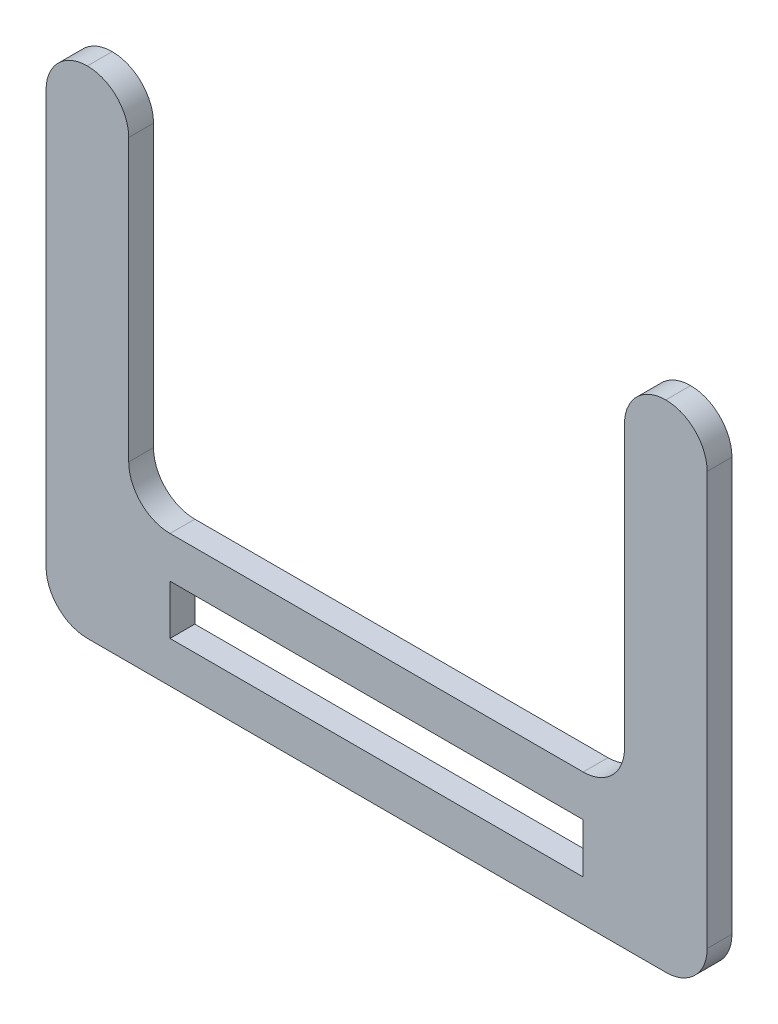
ISO-10303-21;
HEADER;
FILE_DESCRIPTION(('STEP AP214'),'2;1');
FILE_NAME('part.step','',(''),(''),'','','');
FILE_SCHEMA(('AUTOMOTIVE_DESIGN { 1 0 10303 214 1 1 1 1 }'));
ENDSEC;
DATA;
#1=APPLICATION_CONTEXT('core data for automotive mechanical design processes');
#2=APPLICATION_PROTOCOL_DEFINITION('international standard','automotive_design',2000,#1);
#3=PRODUCT_CONTEXT('',#1,'mechanical');
#4=PRODUCT('Part','Part','',(#3));
#5=PRODUCT_RELATED_PRODUCT_CATEGORY('part','',(#4));
#6=PRODUCT_DEFINITION_FORMATION('','',#4);
#7=PRODUCT_DEFINITION_CONTEXT('part definition',#1,'design');
#8=PRODUCT_DEFINITION('design','',#6,#7);
#9=PRODUCT_DEFINITION_SHAPE('','',#8);
#10=(LENGTH_UNIT() NAMED_UNIT(*) SI_UNIT(.MILLI.,.METRE.));
#11=(NAMED_UNIT(*) PLANE_ANGLE_UNIT() SI_UNIT($,.RADIAN.));
#12=(NAMED_UNIT(*) SI_UNIT($,.STERADIAN.) SOLID_ANGLE_UNIT());
#13=UNCERTAINTY_MEASURE_WITH_UNIT(LENGTH_MEASURE(1.E-05),#10,'distance_accuracy_value','');
#14=(GEOMETRIC_REPRESENTATION_CONTEXT(3) GLOBAL_UNCERTAINTY_ASSIGNED_CONTEXT((#13)) GLOBAL_UNIT_ASSIGNED_CONTEXT((#10,
#11,#12)) REPRESENTATION_CONTEXT('',''));
#15=CARTESIAN_POINT('',(0.,0.,0.));
#16=DIRECTION('',(0.,0.,1.));
#17=DIRECTION('',(1.,0.,0.));
#18=AXIS2_PLACEMENT_3D('',#15,#16,#17);
#19=CARTESIAN_POINT('',(-63.8455105633809,-4.50457746478873,2.99999999999977));
#20=DIRECTION('',(1.00000000000001,0.,0.));
#21=DIRECTION('',(0.,1.,0.));
#22=AXIS2_PLACEMENT_3D('',#19,#20,#21);
#23=PLANE('',#22);
#24=DIRECTION('',(0.,-1.,0.));
#25=VECTOR('',#24,1.);
#26=CARTESIAN_POINT('',(-63.8455105633809,-4.50457746478873,2.99999999999977));
#27=LINE('',#26,#25);
#28=CARTESIAN_POINT('',(-63.8455105633811,50.4954225352113,2.99999999999967));
#29=VERTEX_POINT('',#28);
#30=CARTESIAN_POINT('',(-63.8455105633809,0.495422535211267,2.99999999999981));
#31=VERTEX_POINT('',#30);
#32=EDGE_CURVE('E210',#29,#31,#27,.T.);
#33=ORIENTED_EDGE('',*,*,#32,.F.);
#34=DIRECTION('',(0.,0.,-1.00000000000001));
#35=VECTOR('',#34,1.);
#36=CARTESIAN_POINT('',(-63.8455105633811,50.4954225352113,2.99999999999967));
#37=LINE('',#36,#35);
#38=CARTESIAN_POINT('',(-63.8455105633811,50.4954225352113,-2.08166817117217E-13));
#39=VERTEX_POINT('',#38);
#40=EDGE_CURVE('E278',#29,#39,#37,.T.);
#41=ORIENTED_EDGE('',*,*,#40,.T.);
#42=DIRECTION('',(0.,-1.,0.));
#43=VECTOR('',#42,1.);
#44=CARTESIAN_POINT('',(-63.8455105633811,-4.50457746478872,-2.35922392732846E-13));
#45=LINE('',#44,#43);
#46=CARTESIAN_POINT('',(-63.8455105633811,0.495422535211357,0.));
#47=VERTEX_POINT('',#46);
#48=EDGE_CURVE('E190',#39,#47,#45,.T.);
#49=ORIENTED_EDGE('',*,*,#48,.T.);
#50=DIRECTION('',(0.,0.,-1.00000000000001));
#51=VECTOR('',#50,1.);
#52=CARTESIAN_POINT('',(-63.8455105633809,0.495422535211267,2.99999999999981));
#53=LINE('',#52,#51);
#54=EDGE_CURVE('E276',#47,#31,#53,.F.);
#55=ORIENTED_EDGE('',*,*,#54,.T.);
#56=EDGE_LOOP('',(#33,#41,#49,#55));
#57=FACE_BOUND('',#56,.T.);
#58=ADVANCED_FACE('F36',(#57),#23,.F.);
#59=CARTESIAN_POINT('',(-63.8455105633809,-4.50457746478873,2.99999999999977));
#60=DIRECTION('',(0.,1.,0.));
#61=DIRECTION('',(0.,0.,1.00000000000001));
#62=AXIS2_PLACEMENT_3D('',#59,#60,#61);
#63=PLANE('',#62);
#64=DIRECTION('',(1.00000000000001,0.,0.));
#65=VECTOR('',#64,1.);
#66=CARTESIAN_POINT('',(-63.8455105633811,-4.50457746478872,-2.35922392732846E-13));
#67=LINE('',#66,#65);
#68=CARTESIAN_POINT('',(-58.8455105633809,-4.50457746478868,-1.94289029309402E-13));
#69=VERTEX_POINT('',#68);
#70=CARTESIAN_POINT('',(11.1544894366199,-4.50457746478872,-1.66533453693773E-13));
#71=VERTEX_POINT('',#70);
#72=EDGE_CURVE('E195',#69,#71,#67,.T.);
#73=ORIENTED_EDGE('',*,*,#72,.T.);
#74=DIRECTION('',(0.,0.,-1.00000000000001));
#75=VECTOR('',#74,1.);
#76=CARTESIAN_POINT('',(11.1544894366198,-4.50457746478882,2.99999999999989));
#77=LINE('',#76,#75);
#78=CARTESIAN_POINT('',(11.1544894366198,-4.50457746478882,2.99999999999989));
#79=VERTEX_POINT('',#78);
#80=EDGE_CURVE('E283',#71,#79,#77,.F.);
#81=ORIENTED_EDGE('',*,*,#80,.T.);
#82=DIRECTION('',(1.00000000000001,0.,0.));
#83=VECTOR('',#82,1.);
#84=CARTESIAN_POINT('',(-63.8455105633809,-4.50457746478873,2.99999999999977));
#85=LINE('',#84,#83);
#86=CARTESIAN_POINT('',(-58.8455105633809,-4.50457746478873,2.9999999999997));
#87=VERTEX_POINT('',#86);
#88=EDGE_CURVE('E213',#87,#79,#85,.T.);
#89=ORIENTED_EDGE('',*,*,#88,.F.);
#90=DIRECTION('',(0.,0.,-1.00000000000001));
#91=VECTOR('',#90,1.);
#92=CARTESIAN_POINT('',(-58.8455105633809,-4.50457746478873,2.9999999999997));
#93=LINE('',#92,#91);
#94=EDGE_CURVE('E280',#87,#69,#93,.T.);
#95=ORIENTED_EDGE('',*,*,#94,.T.);
#96=EDGE_LOOP('',(#73,#81,#89,#95));
#97=FACE_BOUND('',#96,.T.);
#98=ADVANCED_FACE('F344',(#97),#63,.F.);
#99=CARTESIAN_POINT('',(16.1544894366199,55.4954225352114,2.99999999999993));
#100=DIRECTION('',(-1.00000000000001,0.,0.));
#101=DIRECTION('',(0.,-1.,0.));
#102=AXIS2_PLACEMENT_3D('',#99,#100,#101);
#103=PLANE('',#102);
#104=DIRECTION('',(0.,1.,0.));
#105=VECTOR('',#104,1.);
#106=CARTESIAN_POINT('',(16.1544894366199,55.4954225352113,0.));
#107=LINE('',#106,#105);
#108=CARTESIAN_POINT('',(16.15448943662,0.49542253521128,-1.2490009027033E-13));
#109=VERTEX_POINT('',#108);
#110=CARTESIAN_POINT('',(16.1544894366199,50.4954225352113,0.));
#111=VERTEX_POINT('',#110);
#112=EDGE_CURVE('E198',#109,#111,#107,.T.);
#113=ORIENTED_EDGE('',*,*,#112,.T.);
#114=DIRECTION('',(0.,0.,-1.00000000000001));
#115=VECTOR('',#114,1.);
#116=CARTESIAN_POINT('',(16.1544894366199,50.4954225352114,2.99999999999986));
#117=LINE('',#116,#115);
#118=CARTESIAN_POINT('',(16.1544894366199,50.4954225352114,2.99999999999986));
#119=VERTEX_POINT('',#118);
#120=EDGE_CURVE('E263',#111,#119,#117,.F.);
#121=ORIENTED_EDGE('',*,*,#120,.T.);
#122=DIRECTION('',(0.,1.,0.));
#123=VECTOR('',#122,1.);
#124=CARTESIAN_POINT('',(16.1544894366199,55.4954225352114,2.99999999999993));
#125=LINE('',#124,#123);
#126=CARTESIAN_POINT('',(16.15448943662,0.495422535211169,2.99999999999999));
#127=VERTEX_POINT('',#126);
#128=EDGE_CURVE('E216',#127,#119,#125,.T.);
#129=ORIENTED_EDGE('',*,*,#128,.F.);
#130=DIRECTION('',(0.,0.,-1.00000000000001));
#131=VECTOR('',#130,1.);
#132=CARTESIAN_POINT('',(16.15448943662,0.495422535211155,2.99999999999999));
#133=LINE('',#132,#131);
#134=EDGE_CURVE('E260',#127,#109,#133,.T.);
#135=ORIENTED_EDGE('',*,*,#134,.T.);
#136=EDGE_LOOP('',(#113,#121,#129,#135));
#137=FACE_BOUND('',#136,.T.);
#138=ADVANCED_FACE('F349',(#137),#103,.F.);
#139=CARTESIAN_POINT('',(6.15448943661978,11.4954225352113,2.99999999999992));
#140=DIRECTION('',(1.00000000000001,0.,0.));
#141=DIRECTION('',(0.,1.,0.));
#142=AXIS2_PLACEMENT_3D('',#139,#140,#141);
#143=PLANE('',#142);
#144=DIRECTION('',(0.,-1.,0.));
#145=VECTOR('',#144,1.);
#146=CARTESIAN_POINT('',(6.15448943661984,11.4954225352113,-2.35922392732846E-13));
#147=LINE('',#146,#145);
#148=CARTESIAN_POINT('',(6.15448943661978,50.4954225352112,-2.63677968348475E-13));
#149=VERTEX_POINT('',#148);
#150=CARTESIAN_POINT('',(6.15448943661978,16.4954225352113,-3.33066907387547E-13));
#151=VERTEX_POINT('',#150);
#152=EDGE_CURVE('E201',#149,#151,#147,.T.);
#153=ORIENTED_EDGE('',*,*,#152,.T.);
#154=DIRECTION('',(0.,0.,-1.00000000000001));
#155=VECTOR('',#154,1.);
#156=CARTESIAN_POINT('',(6.15448943661978,16.4954225352113,2.99999999999977));
#157=LINE('',#156,#155);
#158=CARTESIAN_POINT('',(6.15448943661978,16.4954225352113,2.99999999999977));
#159=VERTEX_POINT('',#158);
#160=EDGE_CURVE('E246',#151,#159,#157,.F.);
#161=ORIENTED_EDGE('',*,*,#160,.T.);
#162=DIRECTION('',(0.,-1.,0.));
#163=VECTOR('',#162,1.);
#164=CARTESIAN_POINT('',(6.15448943661978,11.4954225352113,2.99999999999992));
#165=LINE('',#164,#163);
#166=CARTESIAN_POINT('',(6.15448943661978,50.4954225352113,2.99999999999971));
#167=VERTEX_POINT('',#166);
#168=EDGE_CURVE('E218',#167,#159,#165,.T.);
#169=ORIENTED_EDGE('',*,*,#168,.F.);
#170=DIRECTION('',(0.,0.,-1.00000000000001));
#171=VECTOR('',#170,1.);
#172=CARTESIAN_POINT('',(6.15448943661978,50.4954225352113,2.99999999999971));
#173=LINE('',#172,#171);
#174=EDGE_CURVE('E244',#167,#149,#173,.T.);
#175=ORIENTED_EDGE('',*,*,#174,.T.);
#176=EDGE_LOOP('',(#153,#161,#169,#175));
#177=FACE_BOUND('',#176,.T.);
#178=ADVANCED_FACE('F297',(#177),#143,.F.);
#179=CARTESIAN_POINT('',(-53.8455105633808,11.4954225352113,2.99999999999981));
#180=DIRECTION('',(0.,-1.,0.));
#181=DIRECTION('',(1.00000000000001,0.,0.));
#182=AXIS2_PLACEMENT_3D('',#179,#180,#181);
#183=PLANE('',#182);
#184=DIRECTION('',(-1.00000000000001,0.,0.));
#185=VECTOR('',#184,1.);
#186=CARTESIAN_POINT('',(-53.8455105633808,11.4954225352113,-1.38777878078145E-13));
#187=LINE('',#186,#185);
#188=CARTESIAN_POINT('',(1.15448943661978,11.4954225352113,-2.08166817117217E-13));
#189=VERTEX_POINT('',#188);
#190=CARTESIAN_POINT('',(-48.8455105633807,11.4954225352113,-2.77555756156289E-13));
#191=VERTEX_POINT('',#190);
#192=EDGE_CURVE('E204',#189,#191,#187,.T.);
#193=ORIENTED_EDGE('',*,*,#192,.T.);
#194=DIRECTION('',(0.,0.,-1.00000000000001));
#195=VECTOR('',#194,1.);
#196=CARTESIAN_POINT('',(-48.8455105633807,11.4954225352113,2.99999999999982));
#197=LINE('',#196,#195);
#198=CARTESIAN_POINT('',(-48.8455105633807,11.4954225352113,2.99999999999982));
#199=VERTEX_POINT('',#198);
#200=EDGE_CURVE('E242',#191,#199,#197,.F.);
#201=ORIENTED_EDGE('',*,*,#200,.T.);
#202=DIRECTION('',(-1.00000000000001,0.,0.));
#203=VECTOR('',#202,1.);
#204=CARTESIAN_POINT('',(-53.8455105633808,11.4954225352113,2.99999999999981));
#205=LINE('',#204,#203);
#206=CARTESIAN_POINT('',(1.15448943661975,11.4954225352113,3.00000000000009));
#207=VERTEX_POINT('',#206);
#208=EDGE_CURVE('E221',#207,#199,#205,.T.);
#209=ORIENTED_EDGE('',*,*,#208,.F.);
#210=DIRECTION('',(0.,0.,-1.00000000000001));
#211=VECTOR('',#210,1.);
#212=CARTESIAN_POINT('',(1.15448943661978,11.4954225352113,-2.08166817117217E-13));
#213=LINE('',#212,#211);
#214=EDGE_CURVE('E239',#207,#189,#213,.T.);
#215=ORIENTED_EDGE('',*,*,#214,.T.);
#216=EDGE_LOOP('',(#193,#201,#209,#215));
#217=FACE_BOUND('',#216,.T.);
#218=ADVANCED_FACE('F305',(#217),#183,.F.);
#219=CARTESIAN_POINT('',(-53.8455105633809,55.4954225352113,2.99999999999985));
#220=DIRECTION('',(-1.00000000000001,0.,0.));
#221=DIRECTION('',(0.,-1.,0.));
#222=AXIS2_PLACEMENT_3D('',#219,#220,#221);
#223=PLANE('',#222);
#224=DIRECTION('',(0.,1.,0.));
#225=VECTOR('',#224,1.);
#226=CARTESIAN_POINT('',(-53.8455105633809,55.4954225352113,2.99999999999985));
#227=LINE('',#226,#225);
#228=CARTESIAN_POINT('',(-53.8455105633809,16.4954225352113,2.99999999999973));
#229=VERTEX_POINT('',#228);
#230=CARTESIAN_POINT('',(-53.8455105633809,50.4954225352113,2.99999999999977));
#231=VERTEX_POINT('',#230);
#232=EDGE_CURVE('E224',#229,#231,#227,.T.);
#233=ORIENTED_EDGE('',*,*,#232,.F.);
#234=DIRECTION('',(0.,0.,-1.00000000000001));
#235=VECTOR('',#234,1.);
#236=CARTESIAN_POINT('',(-53.8455105633809,16.4954225352113,-2.77555756156289E-13));
#237=LINE('',#236,#235);
#238=CARTESIAN_POINT('',(-53.8455105633809,16.4954225352113,-2.77555756156289E-13));
#239=VERTEX_POINT('',#238);
#240=EDGE_CURVE('E236',#229,#239,#237,.T.);
#241=ORIENTED_EDGE('',*,*,#240,.T.);
#242=DIRECTION('',(0.,1.,0.));
#243=VECTOR('',#242,1.);
#244=CARTESIAN_POINT('',(-53.845510563381,55.4954225352113,-1.80411241501588E-13));
#245=LINE('',#244,#243);
#246=CARTESIAN_POINT('',(-53.8455105633809,50.4954225352113,-3.19189119579733E-13));
#247=VERTEX_POINT('',#246);
#248=EDGE_CURVE('E207',#239,#247,#245,.T.);
#249=ORIENTED_EDGE('',*,*,#248,.T.);
#250=DIRECTION('',(0.,0.,-1.00000000000001));
#251=VECTOR('',#250,1.);
#252=CARTESIAN_POINT('',(-53.8455105633809,50.4954225352113,2.99999999999977));
#253=LINE('',#252,#251);
#254=EDGE_CURVE('E233',#247,#231,#253,.F.);
#255=ORIENTED_EDGE('',*,*,#254,.T.);
#256=EDGE_LOOP('',(#233,#241,#249,#255));
#257=FACE_BOUND('',#256,.T.);
#258=ADVANCED_FACE('F312',(#257),#223,.F.);
#259=CARTESIAN_POINT('',(-63.8455105633811,55.4954225352113,2.99999999999982));
#260=DIRECTION('',(0.,0.,-1.00000000000001));
#261=DIRECTION('',(-1.00000000000001,0.,0.));
#262=AXIS2_PLACEMENT_3D('',#259,#260,#261);
#263=PLANE('',#262);
#264=DIRECTION('',(1.00000000000001,0.,0.));
#265=VECTOR('',#264,1.);
#266=CARTESIAN_POINT('',(-48.8455105633807,0.495422535211176,2.99999999999986));
#267=LINE('',#266,#265);
#268=CARTESIAN_POINT('',(-48.8455105633807,0.495422535211176,2.99999999999986));
#269=VERTEX_POINT('',#268);
#270=CARTESIAN_POINT('',(1.1544894366197,0.495422535211176,3.00000000000009));
#271=VERTEX_POINT('',#270);
#272=EDGE_CURVE('E174',#269,#271,#267,.T.);
#273=ORIENTED_EDGE('',*,*,#272,.F.);
#274=DIRECTION('',(0.,-1.,0.));
#275=VECTOR('',#274,1.);
#276=CARTESIAN_POINT('',(-48.8455105633808,6.49542253521117,2.99999999999974));
#277=LINE('',#276,#275);
#278=CARTESIAN_POINT('',(-48.8455105633808,6.49542253521117,2.99999999999974));
#279=VERTEX_POINT('',#278);
#280=EDGE_CURVE('E179',#279,#269,#277,.T.);
#281=ORIENTED_EDGE('',*,*,#280,.F.);
#282=DIRECTION('',(-1.00000000000001,0.,0.));
#283=VECTOR('',#282,1.);
#284=CARTESIAN_POINT('',(-48.8455105633808,6.49542253521117,2.99999999999974));
#285=LINE('',#284,#283);
#286=CARTESIAN_POINT('',(1.15448943661969,6.49542253521117,2.99999999999993));
#287=VERTEX_POINT('',#286);
#288=EDGE_CURVE('E183',#287,#279,#285,.T.);
#289=ORIENTED_EDGE('',*,*,#288,.F.);
#290=DIRECTION('',(0.,1.,0.));
#291=VECTOR('',#290,1.);
#292=CARTESIAN_POINT('',(1.15448943661969,6.49542253521117,2.99999999999993));
#293=LINE('',#292,#291);
#294=EDGE_CURVE('E163',#271,#287,#293,.T.);
#295=ORIENTED_EDGE('',*,*,#294,.F.);
#296=EDGE_LOOP('',(#273,#281,#289,#295));
#297=FACE_BOUND('',#296,.T.);
#298=ORIENTED_EDGE('',*,*,#128,.T.);
#299=CARTESIAN_POINT('',(11.1544894366198,50.4954225352113,2.99999999999977));
#300=DIRECTION('',(0.,0.,-1.00000000000001));
#301=DIRECTION('',(-1.00000000000001,0.,0.));
#302=AXIS2_PLACEMENT_3D('',#299,#300,#301);
#303=CIRCLE('',#302,5.);
#304=CARTESIAN_POINT('',(11.1544894366198,55.4954225352113,2.99999999999995));
#305=VERTEX_POINT('',#304);
#306=EDGE_CURVE('E57',#119,#305,#303,.F.);
#307=ORIENTED_EDGE('',*,*,#306,.T.);
#308=CARTESIAN_POINT('',(11.1544894366198,50.4954225352113,2.99999999999978));
#309=DIRECTION('',(0.,0.,-1.00000000000001));
#310=DIRECTION('',(-1.00000000000001,0.,0.));
#311=AXIS2_PLACEMENT_3D('',#308,#309,#310);
#312=CIRCLE('',#311,5.);
#313=EDGE_CURVE('E273',#305,#167,#312,.F.);
#314=ORIENTED_EDGE('',*,*,#313,.T.);
#315=ORIENTED_EDGE('',*,*,#168,.T.);
#316=CARTESIAN_POINT('',(1.15448943661973,16.4954225352113,2.99999999999978));
#317=DIRECTION('',(0.,0.,-1.00000000000001));
#318=DIRECTION('',(-1.00000000000001,0.,0.));
#319=AXIS2_PLACEMENT_3D('',#316,#317,#318);
#320=CIRCLE('',#319,5.);
#321=EDGE_CURVE('E11',#159,#207,#320,.T.);
#322=ORIENTED_EDGE('',*,*,#321,.T.);
#323=ORIENTED_EDGE('',*,*,#208,.T.);
#324=CARTESIAN_POINT('',(-48.8455105633808,16.4954225352113,2.99999999999975));
#325=DIRECTION('',(0.,0.,-1.00000000000001));
#326=DIRECTION('',(-1.00000000000001,0.,0.));
#327=AXIS2_PLACEMENT_3D('',#324,#325,#326);
#328=CIRCLE('',#327,5.);
#329=EDGE_CURVE('E287',#199,#229,#328,.T.);
#330=ORIENTED_EDGE('',*,*,#329,.T.);
#331=ORIENTED_EDGE('',*,*,#232,.T.);
#332=CARTESIAN_POINT('',(-58.8455105633811,50.4954225352113,2.99999999999966));
#333=DIRECTION('',(0.,0.,-1.00000000000001));
#334=DIRECTION('',(-1.00000000000001,0.,0.));
#335=AXIS2_PLACEMENT_3D('',#332,#333,#334);
#336=CIRCLE('',#335,5.);
#337=CARTESIAN_POINT('',(-58.8455105633811,55.4954225352113,2.99999999999977));
#338=VERTEX_POINT('',#337);
#339=EDGE_CURVE('E50',#231,#338,#336,.F.);
#340=ORIENTED_EDGE('',*,*,#339,.T.);
#341=CARTESIAN_POINT('',(-58.8455105633811,50.4954225352113,2.99999999999966));
#342=DIRECTION('',(0.,0.,-1.00000000000001));
#343=DIRECTION('',(-1.00000000000001,0.,0.));
#344=AXIS2_PLACEMENT_3D('',#341,#342,#343);
#345=CIRCLE('',#344,5.);
#346=EDGE_CURVE('E270',#338,#29,#345,.F.);
#347=ORIENTED_EDGE('',*,*,#346,.T.);
#348=ORIENTED_EDGE('',*,*,#32,.T.);
#349=CARTESIAN_POINT('',(-58.845510563381,0.495422535211287,2.99999999999982));
#350=DIRECTION('',(0.,0.,-1.00000000000001));
#351=DIRECTION('',(-1.00000000000001,0.,0.));
#352=AXIS2_PLACEMENT_3D('',#349,#350,#351);
#353=CIRCLE('',#352,5.);
#354=EDGE_CURVE('E266',#31,#87,#353,.F.);
#355=ORIENTED_EDGE('',*,*,#354,.T.);
#356=ORIENTED_EDGE('',*,*,#88,.T.);
#357=CARTESIAN_POINT('',(11.1544894366199,0.495422535211176,3.00000000000004));
#358=DIRECTION('',(0.,0.,-1.00000000000001));
#359=DIRECTION('',(-1.00000000000001,0.,0.));
#360=AXIS2_PLACEMENT_3D('',#357,#358,#359);
#361=CIRCLE('',#360,5.);
#362=EDGE_CURVE('E268',#79,#127,#361,.F.);
#363=ORIENTED_EDGE('',*,*,#362,.T.);
#364=EDGE_LOOP('',(#298,#307,#314,#315,#322,#323,#330,#331,#340,#347,#348,#355,#356,#363));
#365=FACE_BOUND('',#364,.T.);
#366=ADVANCED_FACE('F181',(#297,#365),#263,.F.);
#367=CARTESIAN_POINT('',(-63.8455105633811,55.4954225352113,-1.52655665885959E-13));
#368=DIRECTION('',(0.,0.,-1.00000000000001));
#369=DIRECTION('',(-1.00000000000001,0.,0.));
#370=AXIS2_PLACEMENT_3D('',#367,#368,#369);
#371=PLANE('',#370);
#372=DIRECTION('',(0.,1.,0.));
#373=VECTOR('',#372,1.);
#374=CARTESIAN_POINT('',(-48.8455105633808,55.4954225352113,-3.88578058618805E-13));
#375=LINE('',#374,#373);
#376=CARTESIAN_POINT('',(-48.8455105633808,0.495422535211357,-1.94289029309402E-13));
#377=VERTEX_POINT('',#376);
#378=CARTESIAN_POINT('',(-48.8455105633808,6.49542253521136,-3.88578058618805E-13));
#379=VERTEX_POINT('',#378);
#380=EDGE_CURVE('E231',#377,#379,#375,.T.);
#381=ORIENTED_EDGE('',*,*,#380,.F.);
#382=DIRECTION('',(-1.00000000000001,0.,0.));
#383=VECTOR('',#382,1.);
#384=CARTESIAN_POINT('',(-63.8455105633812,0.495422535211357,0.));
#385=LINE('',#384,#383);
#386=CARTESIAN_POINT('',(1.15448943661973,0.495422535211267,-2.35922392732846E-13));
#387=VERTEX_POINT('',#386);
#388=EDGE_CURVE('E226',#387,#377,#385,.T.);
#389=ORIENTED_EDGE('',*,*,#388,.F.);
#390=DIRECTION('',(0.,-1.,0.));
#391=VECTOR('',#390,1.);
#392=CARTESIAN_POINT('',(1.15448943661972,55.4954225352113,0.));
#393=LINE('',#392,#391);
#394=CARTESIAN_POINT('',(1.15448943661973,6.49542253521127,-3.33066907387547E-13));
#395=VERTEX_POINT('',#394);
#396=EDGE_CURVE('E166',#395,#387,#393,.T.);
#397=ORIENTED_EDGE('',*,*,#396,.F.);
#398=DIRECTION('',(1.00000000000001,0.,0.));
#399=VECTOR('',#398,1.);
#400=CARTESIAN_POINT('',(-63.8455105633812,6.49542253521127,-2.35922392732846E-13));
#401=LINE('',#400,#399);
#402=EDGE_CURVE('E229',#379,#395,#401,.T.);
#403=ORIENTED_EDGE('',*,*,#402,.F.);
#404=EDGE_LOOP('',(#381,#389,#397,#403));
#405=FACE_BOUND('',#404,.T.);
#406=CARTESIAN_POINT('',(11.1544894366198,50.4954225352112,0.));
#407=DIRECTION('',(0.,0.,-1.00000000000001));
#408=DIRECTION('',(-1.00000000000001,0.,0.));
#409=AXIS2_PLACEMENT_3D('',#406,#407,#408);
#410=CIRCLE('',#409,5.);
#411=CARTESIAN_POINT('',(11.1544894366199,55.4954225352113,0.));
#412=VERTEX_POINT('',#411);
#413=EDGE_CURVE('E256',#149,#412,#410,.T.);
#414=ORIENTED_EDGE('',*,*,#413,.T.);
#415=CARTESIAN_POINT('',(11.1544894366198,50.4954225352112,0.));
#416=DIRECTION('',(0.,0.,-1.00000000000001));
#417=DIRECTION('',(-1.00000000000001,0.,0.));
#418=AXIS2_PLACEMENT_3D('',#415,#416,#417);
#419=CIRCLE('',#418,5.);
#420=EDGE_CURVE('E258',#412,#111,#419,.T.);
#421=ORIENTED_EDGE('',*,*,#420,.T.);
#422=ORIENTED_EDGE('',*,*,#112,.F.);
#423=CARTESIAN_POINT('',(11.1544894366199,0.495422535211267,0.));
#424=DIRECTION('',(0.,0.,-1.00000000000001));
#425=DIRECTION('',(-1.00000000000001,0.,0.));
#426=AXIS2_PLACEMENT_3D('',#423,#424,#425);
#427=CIRCLE('',#426,5.);
#428=EDGE_CURVE('E250',#109,#71,#427,.T.);
#429=ORIENTED_EDGE('',*,*,#428,.T.);
#430=ORIENTED_EDGE('',*,*,#72,.F.);
#431=CARTESIAN_POINT('',(-58.8455105633809,0.495422535211294,-1.2490009027033E-13));
#432=DIRECTION('',(0.,0.,-1.00000000000001));
#433=DIRECTION('',(-1.00000000000001,0.,0.));
#434=AXIS2_PLACEMENT_3D('',#431,#432,#433);
#435=CIRCLE('',#434,5.);
#436=EDGE_CURVE('E248',#69,#47,#435,.T.);
#437=ORIENTED_EDGE('',*,*,#436,.T.);
#438=ORIENTED_EDGE('',*,*,#48,.F.);
#439=CARTESIAN_POINT('',(-58.845510563381,50.4954225352112,-2.4980018054066E-13));
#440=DIRECTION('',(0.,0.,-1.00000000000001));
#441=DIRECTION('',(-1.00000000000001,0.,0.));
#442=AXIS2_PLACEMENT_3D('',#439,#440,#441);
#443=CIRCLE('',#442,5.);
#444=CARTESIAN_POINT('',(-58.845510563381,55.4954225352112,-1.80411241501588E-13));
#445=VERTEX_POINT('',#444);
#446=EDGE_CURVE('E252',#39,#445,#443,.T.);
#447=ORIENTED_EDGE('',*,*,#446,.T.);
#448=CARTESIAN_POINT('',(-58.845510563381,50.4954225352112,-2.4980018054066E-13));
#449=DIRECTION('',(0.,0.,-1.00000000000001));
#450=DIRECTION('',(-1.00000000000001,0.,0.));
#451=AXIS2_PLACEMENT_3D('',#448,#449,#450);
#452=CIRCLE('',#451,5.);
#453=EDGE_CURVE('E254',#445,#247,#452,.T.);
#454=ORIENTED_EDGE('',*,*,#453,.T.);
#455=ORIENTED_EDGE('',*,*,#248,.F.);
#456=CARTESIAN_POINT('',(-48.8455105633808,16.4954225352113,-3.7470027081099E-13));
#457=DIRECTION('',(0.,0.,-1.00000000000001));
#458=DIRECTION('',(-1.00000000000001,0.,0.));
#459=AXIS2_PLACEMENT_3D('',#456,#457,#458);
#460=CIRCLE('',#459,5.);
#461=EDGE_CURVE('E285',#239,#191,#460,.F.);
#462=ORIENTED_EDGE('',*,*,#461,.T.);
#463=ORIENTED_EDGE('',*,*,#192,.F.);
#464=CARTESIAN_POINT('',(1.15448943661975,16.4954225352113,-3.05311331771918E-13));
#465=DIRECTION('',(0.,0.,-1.00000000000001));
#466=DIRECTION('',(-1.00000000000001,0.,0.));
#467=AXIS2_PLACEMENT_3D('',#464,#465,#466);
#468=CIRCLE('',#467,5.);
#469=EDGE_CURVE('E43',#189,#151,#468,.F.);
#470=ORIENTED_EDGE('',*,*,#469,.T.);
#471=ORIENTED_EDGE('',*,*,#152,.F.);
#472=EDGE_LOOP('',(#414,#421,#422,#429,#430,#437,#438,#447,#454,#455,#462,#463,#470,#471));
#473=FACE_BOUND('',#472,.T.);
#474=ADVANCED_FACE('F291',(#405,#473),#371,.T.);
#475=CARTESIAN_POINT('',(-48.8455105633808,6.49542253521136,-3.00000000000031));
#476=DIRECTION('',(-1.00000000000001,0.,0.));
#477=DIRECTION('',(0.,-1.,0.));
#478=AXIS2_PLACEMENT_3D('',#475,#476,#477);
#479=PLANE('',#478);
#480=ORIENTED_EDGE('',*,*,#380,.T.);
#481=DIRECTION('',(0.,0.,1.00000000000001));
#482=VECTOR('',#481,1.);
#483=CARTESIAN_POINT('',(-48.8455105633808,6.49542253521136,-3.00000000000031));
#484=LINE('',#483,#482);
#485=EDGE_CURVE('E188',#379,#279,#484,.T.);
#486=ORIENTED_EDGE('',*,*,#485,.T.);
#487=ORIENTED_EDGE('',*,*,#280,.T.);
#488=DIRECTION('',(0.,0.,1.00000000000001));
#489=VECTOR('',#488,1.);
#490=CARTESIAN_POINT('',(-48.8455105633808,0.495422535211364,-3.00000000000016));
#491=LINE('',#490,#489);
#492=EDGE_CURVE('E170',#377,#269,#491,.T.);
#493=ORIENTED_EDGE('',*,*,#492,.F.);
#494=EDGE_LOOP('',(#480,#486,#487,#493));
#495=FACE_BOUND('',#494,.T.);
#496=ADVANCED_FACE('F328',(#495),#479,.F.);
#497=CARTESIAN_POINT('',(-48.8455105633808,6.49542253521136,-3.00000000000031));
#498=DIRECTION('',(0.,1.,0.));
#499=DIRECTION('',(0.,0.,1.00000000000001));
#500=AXIS2_PLACEMENT_3D('',#497,#498,#499);
#501=PLANE('',#500);
#502=ORIENTED_EDGE('',*,*,#402,.T.);
#503=DIRECTION('',(0.,0.,1.00000000000001));
#504=VECTOR('',#503,1.);
#505=CARTESIAN_POINT('',(1.15448943661974,6.49542253521127,-3.00000000000018));
#506=LINE('',#505,#504);
#507=EDGE_CURVE('E169',#395,#287,#506,.T.);
#508=ORIENTED_EDGE('',*,*,#507,.T.);
#509=ORIENTED_EDGE('',*,*,#288,.T.);
#510=ORIENTED_EDGE('',*,*,#485,.F.);
#511=EDGE_LOOP('',(#502,#508,#509,#510));
#512=FACE_BOUND('',#511,.T.);
#513=ADVANCED_FACE('F333',(#512),#501,.F.);
#514=CARTESIAN_POINT('',(1.15448943661974,6.49542253521127,-3.00000000000018));
#515=DIRECTION('',(1.00000000000001,0.,0.));
#516=DIRECTION('',(0.,1.,0.));
#517=AXIS2_PLACEMENT_3D('',#514,#515,#516);
#518=PLANE('',#517);
#519=ORIENTED_EDGE('',*,*,#396,.T.);
#520=DIRECTION('',(0.,0.,1.00000000000001));
#521=VECTOR('',#520,1.);
#522=CARTESIAN_POINT('',(1.15448943661973,0.495422535211273,-3.00000000000024));
#523=LINE('',#522,#521);
#524=EDGE_CURVE('E158',#387,#271,#523,.T.);
#525=ORIENTED_EDGE('',*,*,#524,.T.);
#526=ORIENTED_EDGE('',*,*,#294,.T.);
#527=ORIENTED_EDGE('',*,*,#507,.F.);
#528=EDGE_LOOP('',(#519,#525,#526,#527));
#529=FACE_BOUND('',#528,.T.);
#530=ADVANCED_FACE('F160',(#529),#518,.F.);
#531=CARTESIAN_POINT('',(-48.8455105633808,0.495422535211364,-3.00000000000016));
#532=DIRECTION('',(0.,-1.,0.));
#533=DIRECTION('',(0.,0.,-1.00000000000001));
#534=AXIS2_PLACEMENT_3D('',#531,#532,#533);
#535=PLANE('',#534);
#536=ORIENTED_EDGE('',*,*,#388,.T.);
#537=ORIENTED_EDGE('',*,*,#492,.T.);
#538=ORIENTED_EDGE('',*,*,#272,.T.);
#539=ORIENTED_EDGE('',*,*,#524,.F.);
#540=EDGE_LOOP('',(#536,#537,#538,#539));
#541=FACE_BOUND('',#540,.T.);
#542=ADVANCED_FACE('F175',(#541),#535,.F.);
#543=CARTESIAN_POINT('',(-48.8455105633808,16.4954225352113,2.99999999999975));
#544=DIRECTION('',(0.,0.,1.00000000000001));
#545=DIRECTION('',(1.00000000000001,0.,0.));
#546=AXIS2_PLACEMENT_3D('',#543,#544,#545);
#547=CYLINDRICAL_SURFACE('',#546,5.);
#548=ORIENTED_EDGE('',*,*,#329,.F.);
#549=ORIENTED_EDGE('',*,*,#200,.F.);
#550=ORIENTED_EDGE('',*,*,#461,.F.);
#551=ORIENTED_EDGE('',*,*,#240,.F.);
#552=EDGE_LOOP('',(#548,#549,#550,#551));
#553=FACE_BOUND('',#552,.T.);
#554=ADVANCED_FACE('F308',(#553),#547,.F.);
#555=CARTESIAN_POINT('',(1.15448943661973,16.4954225352113,2.99999999999978));
#556=DIRECTION('',(0.,0.,1.00000000000001));
#557=DIRECTION('',(1.00000000000001,0.,0.));
#558=AXIS2_PLACEMENT_3D('',#555,#556,#557);
#559=CYLINDRICAL_SURFACE('',#558,5.);
#560=ORIENTED_EDGE('',*,*,#321,.F.);
#561=ORIENTED_EDGE('',*,*,#160,.F.);
#562=ORIENTED_EDGE('',*,*,#469,.F.);
#563=ORIENTED_EDGE('',*,*,#214,.F.);
#564=EDGE_LOOP('',(#560,#561,#562,#563));
#565=FACE_BOUND('',#564,.T.);
#566=ADVANCED_FACE('F301',(#565),#559,.F.);
#567=CARTESIAN_POINT('',(11.1544894366198,50.4954225352113,2.99999999999978));
#568=DIRECTION('',(0.,0.,-1.00000000000001));
#569=DIRECTION('',(-1.00000000000001,0.,0.));
#570=AXIS2_PLACEMENT_3D('',#567,#568,#569);
#571=CYLINDRICAL_SURFACE('',#570,5.);
#572=ORIENTED_EDGE('',*,*,#174,.F.);
#573=ORIENTED_EDGE('',*,*,#313,.F.);
#574=DIRECTION('',(0.,0.,-1.00000000000001));
#575=VECTOR('',#574,1.);
#576=CARTESIAN_POINT('',(11.1544894366198,55.4954225352113,2.99999999999995));
#577=LINE('',#576,#575);
#578=EDGE_CURVE('E323',#412,#305,#577,.F.);
#579=ORIENTED_EDGE('',*,*,#578,.F.);
#580=ORIENTED_EDGE('',*,*,#413,.F.);
#581=EDGE_LOOP('',(#572,#573,#579,#580));
#582=FACE_BOUND('',#581,.T.);
#583=ADVANCED_FACE('F376',(#582),#571,.T.);
#584=CARTESIAN_POINT('',(11.1544894366198,50.4954225352113,2.99999999999977));
#585=DIRECTION('',(0.,0.,-1.00000000000001));
#586=DIRECTION('',(-1.00000000000001,0.,0.));
#587=AXIS2_PLACEMENT_3D('',#584,#585,#586);
#588=CYLINDRICAL_SURFACE('',#587,5.);
#589=ORIENTED_EDGE('',*,*,#306,.F.);
#590=ORIENTED_EDGE('',*,*,#120,.F.);
#591=ORIENTED_EDGE('',*,*,#420,.F.);
#592=ORIENTED_EDGE('',*,*,#578,.T.);
#593=EDGE_LOOP('',(#589,#590,#591,#592));
#594=FACE_BOUND('',#593,.T.);
#595=ADVANCED_FACE('F373',(#594),#588,.T.);
#596=CARTESIAN_POINT('',(-58.8455105633811,50.4954225352113,2.99999999999966));
#597=DIRECTION('',(0.,0.,-1.00000000000001));
#598=DIRECTION('',(-1.00000000000001,0.,0.));
#599=AXIS2_PLACEMENT_3D('',#596,#597,#598);
#600=CYLINDRICAL_SURFACE('',#599,5.);
#601=ORIENTED_EDGE('',*,*,#40,.F.);
#602=ORIENTED_EDGE('',*,*,#346,.F.);
#603=DIRECTION('',(0.,0.,-1.00000000000001));
#604=VECTOR('',#603,1.);
#605=CARTESIAN_POINT('',(-58.8455105633811,55.4954225352113,2.99999999999977));
#606=LINE('',#605,#604);
#607=EDGE_CURVE('E320',#445,#338,#606,.F.);
#608=ORIENTED_EDGE('',*,*,#607,.F.);
#609=ORIENTED_EDGE('',*,*,#446,.F.);
#610=EDGE_LOOP('',(#601,#602,#608,#609));
#611=FACE_BOUND('',#610,.T.);
#612=ADVANCED_FACE('F356',(#611),#600,.T.);
#613=CARTESIAN_POINT('',(-58.8455105633811,50.4954225352113,2.99999999999966));
#614=DIRECTION('',(0.,0.,-1.00000000000001));
#615=DIRECTION('',(-1.00000000000001,0.,0.));
#616=AXIS2_PLACEMENT_3D('',#613,#614,#615);
#617=CYLINDRICAL_SURFACE('',#616,5.);
#618=ORIENTED_EDGE('',*,*,#339,.F.);
#619=ORIENTED_EDGE('',*,*,#254,.F.);
#620=ORIENTED_EDGE('',*,*,#453,.F.);
#621=ORIENTED_EDGE('',*,*,#607,.T.);
#622=EDGE_LOOP('',(#618,#619,#620,#621));
#623=FACE_BOUND('',#622,.T.);
#624=ADVANCED_FACE('F317',(#623),#617,.T.);
#625=CARTESIAN_POINT('',(11.1544894366199,0.495422535211176,3.00000000000004));
#626=DIRECTION('',(0.,0.,-1.00000000000001));
#627=DIRECTION('',(-1.00000000000001,0.,0.));
#628=AXIS2_PLACEMENT_3D('',#625,#626,#627);
#629=CYLINDRICAL_SURFACE('',#628,5.);
#630=ORIENTED_EDGE('',*,*,#362,.F.);
#631=ORIENTED_EDGE('',*,*,#80,.F.);
#632=ORIENTED_EDGE('',*,*,#428,.F.);
#633=ORIENTED_EDGE('',*,*,#134,.F.);
#634=EDGE_LOOP('',(#630,#631,#632,#633));
#635=FACE_BOUND('',#634,.T.);
#636=ADVANCED_FACE('F365',(#635),#629,.T.);
#637=CARTESIAN_POINT('',(-58.845510563381,0.495422535211287,2.99999999999982));
#638=DIRECTION('',(0.,0.,-1.00000000000001));
#639=DIRECTION('',(-1.00000000000001,0.,0.));
#640=AXIS2_PLACEMENT_3D('',#637,#638,#639);
#641=CYLINDRICAL_SURFACE('',#640,5.);
#642=ORIENTED_EDGE('',*,*,#354,.F.);
#643=ORIENTED_EDGE('',*,*,#54,.F.);
#644=ORIENTED_EDGE('',*,*,#436,.F.);
#645=ORIENTED_EDGE('',*,*,#94,.F.);
#646=EDGE_LOOP('',(#642,#643,#644,#645));
#647=FACE_BOUND('',#646,.T.);
#648=ADVANCED_FACE('F359',(#647),#641,.T.);
#649=CLOSED_SHELL('',(#58,#98,#138,#178,#218,#258,#366,#474,#496,#513,#530,#542,#554,#566,#583,
#595,#612,#624,#636,#648));
#650=MANIFOLD_SOLID_BREP('B2',#649);
#651=ADVANCED_BREP_SHAPE_REPRESENTATION('',(#18,#650),#14);
#652=SHAPE_DEFINITION_REPRESENTATION(#9,#651);
ENDSEC;
END-ISO-10303-21;
